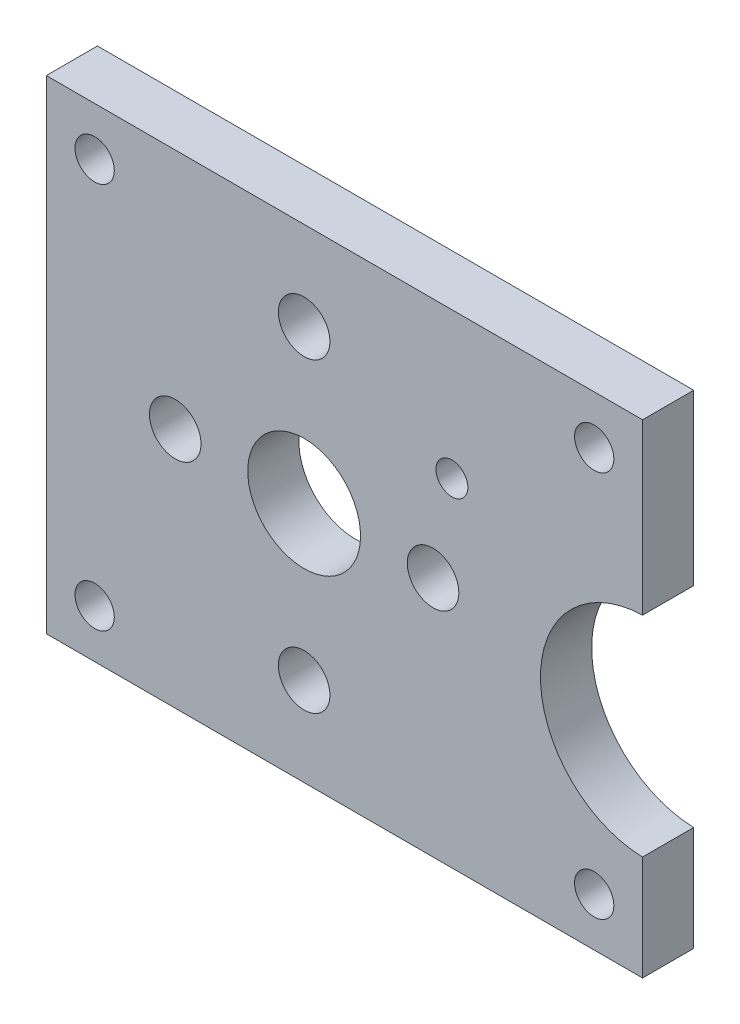
ISO-10303-21;
HEADER;
FILE_DESCRIPTION(('STEP AP214'),'2;1');
FILE_NAME('part.step','',(''),(''),'','','');
FILE_SCHEMA(('AUTOMOTIVE_DESIGN { 1 0 10303 214 1 1 1 1 }'));
ENDSEC;
DATA;
#1=APPLICATION_CONTEXT('core data for automotive mechanical design processes');
#2=APPLICATION_PROTOCOL_DEFINITION('international standard','automotive_design',2000,#1);
#3=PRODUCT_CONTEXT('',#1,'mechanical');
#4=PRODUCT('Part','Part','',(#3));
#5=PRODUCT_RELATED_PRODUCT_CATEGORY('part','',(#4));
#6=PRODUCT_DEFINITION_FORMATION('','',#4);
#7=PRODUCT_DEFINITION_CONTEXT('part definition',#1,'design');
#8=PRODUCT_DEFINITION('design','',#6,#7);
#9=PRODUCT_DEFINITION_SHAPE('','',#8);
#10=(LENGTH_UNIT() NAMED_UNIT(*) SI_UNIT(.MILLI.,.METRE.));
#11=(NAMED_UNIT(*) PLANE_ANGLE_UNIT() SI_UNIT($,.RADIAN.));
#12=(NAMED_UNIT(*) SI_UNIT($,.STERADIAN.) SOLID_ANGLE_UNIT());
#13=UNCERTAINTY_MEASURE_WITH_UNIT(LENGTH_MEASURE(1.E-05),#10,'distance_accuracy_value','');
#14=(GEOMETRIC_REPRESENTATION_CONTEXT(3) GLOBAL_UNCERTAINTY_ASSIGNED_CONTEXT((#13)) GLOBAL_UNIT_ASSIGNED_CONTEXT((#10,
#11,#12)) REPRESENTATION_CONTEXT('',''));
#15=CARTESIAN_POINT('',(0.,0.,0.));
#16=DIRECTION('',(0.,0.,1.));
#17=DIRECTION('',(1.,0.,0.));
#18=AXIS2_PLACEMENT_3D('',#15,#16,#17);
#19=CARTESIAN_POINT('',(37.1666992956996,13.,3.175));
#20=DIRECTION('',(0.,0.,1.));
#21=DIRECTION('',(1.,0.,0.));
#22=AXIS2_PLACEMENT_3D('',#19,#20,#21);
#23=PLANE('',#22);
#24=CARTESIAN_POINT('',(3.,27.,3.175));
#25=DIRECTION('',(0.,0.,1.));
#26=DIRECTION('',(1.,0.,0.));
#27=AXIS2_PLACEMENT_3D('',#24,#25,#26);
#28=CIRCLE('',#27,1.21919999999999);
#29=CARTESIAN_POINT('',(4.21919999999999,27.,3.175));
#30=VERTEX_POINT('',#29);
#31=EDGE_CURVE('E204',#30,#30,#28,.T.);
#32=ORIENTED_EDGE('',*,*,#31,.F.);
#33=EDGE_LOOP('',(#32));
#34=FACE_BOUND('',#33,.T.);
#35=CARTESIAN_POINT('',(3.,3.,3.175));
#36=DIRECTION('',(0.,0.,1.));
#37=DIRECTION('',(1.,0.,0.));
#38=AXIS2_PLACEMENT_3D('',#35,#36,#37);
#39=CIRCLE('',#38,1.21919999999999);
#40=CARTESIAN_POINT('',(4.21919999999999,3.,3.175));
#41=VERTEX_POINT('',#40);
#42=EDGE_CURVE('E208',#41,#41,#39,.T.);
#43=ORIENTED_EDGE('',*,*,#42,.F.);
#44=EDGE_LOOP('',(#43));
#45=FACE_BOUND('',#44,.T.);
#46=CARTESIAN_POINT('',(34.,3.,3.175));
#47=DIRECTION('',(0.,0.,1.));
#48=DIRECTION('',(1.,0.,0.));
#49=AXIS2_PLACEMENT_3D('',#46,#47,#48);
#50=CIRCLE('',#49,1.21919999999999);
#51=CARTESIAN_POINT('',(35.2192,3.,3.175));
#52=VERTEX_POINT('',#51);
#53=EDGE_CURVE('E217',#52,#52,#50,.T.);
#54=ORIENTED_EDGE('',*,*,#53,.F.);
#55=EDGE_LOOP('',(#54));
#56=FACE_BOUND('',#55,.T.);
#57=CARTESIAN_POINT('',(34.,27.,3.175));
#58=DIRECTION('',(0.,0.,1.));
#59=DIRECTION('',(1.,0.,0.));
#60=AXIS2_PLACEMENT_3D('',#57,#58,#59);
#61=CIRCLE('',#60,1.21919999999999);
#62=CARTESIAN_POINT('',(35.2192,27.,3.175));
#63=VERTEX_POINT('',#62);
#64=EDGE_CURVE('E223',#63,#63,#61,.T.);
#65=ORIENTED_EDGE('',*,*,#64,.F.);
#66=EDGE_LOOP('',(#65));
#67=FACE_BOUND('',#66,.T.);
#68=CARTESIAN_POINT('',(8.,15.,3.175));
#69=DIRECTION('',(0.,0.,1.));
#70=DIRECTION('',(-1.,0.,0.));
#71=AXIS2_PLACEMENT_3D('',#68,#69,#70);
#72=CIRCLE('',#71,1.6);
#73=CARTESIAN_POINT('',(6.4,15.,3.175));
#74=VERTEX_POINT('',#73);
#75=EDGE_CURVE('E236',#74,#74,#72,.T.);
#76=ORIENTED_EDGE('',*,*,#75,.F.);
#77=EDGE_LOOP('',(#76));
#78=FACE_BOUND('',#77,.T.);
#79=CARTESIAN_POINT('',(24.,15.,3.175));
#80=DIRECTION('',(0.,0.,1.));
#81=DIRECTION('',(1.,0.,0.));
#82=AXIS2_PLACEMENT_3D('',#79,#80,#81);
#83=CIRCLE('',#82,1.6);
#84=CARTESIAN_POINT('',(25.6,15.,3.175));
#85=VERTEX_POINT('',#84);
#86=EDGE_CURVE('E248',#85,#85,#83,.T.);
#87=ORIENTED_EDGE('',*,*,#86,.F.);
#88=EDGE_LOOP('',(#87));
#89=FACE_BOUND('',#88,.T.);
#90=CARTESIAN_POINT('',(25.1697789659621,20.9334001816327,3.175));
#91=DIRECTION('',(0.,0.,1.));
#92=DIRECTION('',(1.,0.,0.));
#93=AXIS2_PLACEMENT_3D('',#90,#91,#92);
#94=CIRCLE('',#93,0.990600000000001);
#95=CARTESIAN_POINT('',(26.1603789659621,20.9334001816327,3.175));
#96=VERTEX_POINT('',#95);
#97=EDGE_CURVE('E122',#96,#96,#94,.T.);
#98=ORIENTED_EDGE('',*,*,#97,.F.);
#99=EDGE_LOOP('',(#98));
#100=FACE_BOUND('',#99,.T.);
#101=DIRECTION('',(0.,-1.,0.));
#102=VECTOR('',#101,1.);
#103=CARTESIAN_POINT('',(0.,0.,3.175));
#104=LINE('',#103,#102);
#105=CARTESIAN_POINT('',(0.,30.,3.175));
#106=VERTEX_POINT('',#105);
#107=CARTESIAN_POINT('',(0.,0.,3.175));
#108=VERTEX_POINT('',#107);
#109=EDGE_CURVE('E129',#106,#108,#104,.T.);
#110=ORIENTED_EDGE('',*,*,#109,.T.);
#111=DIRECTION('',(1.,0.,0.));
#112=VECTOR('',#111,1.);
#113=CARTESIAN_POINT('',(0.,0.,3.175));
#114=LINE('',#113,#112);
#115=CARTESIAN_POINT('',(37.,0.,3.175));
#116=VERTEX_POINT('',#115);
#117=EDGE_CURVE('E87',#108,#116,#114,.T.);
#118=ORIENTED_EDGE('',*,*,#117,.T.);
#119=DIRECTION('',(0.,1.,0.));
#120=VECTOR('',#119,1.);
#121=CARTESIAN_POINT('',(37.,6.50213794045971,3.175));
#122=LINE('',#121,#120);
#123=CARTESIAN_POINT('',(37.,6.50213794045971,3.175));
#124=VERTEX_POINT('',#123);
#125=EDGE_CURVE('E100',#116,#124,#122,.T.);
#126=ORIENTED_EDGE('',*,*,#125,.T.);
#127=CARTESIAN_POINT('',(37.1666992956996,13.,3.175));
#128=DIRECTION('',(0.,0.,-1.));
#129=DIRECTION('',(1.,0.,0.));
#130=AXIS2_PLACEMENT_3D('',#127,#128,#129);
#131=CIRCLE('',#130,6.5);
#132=CARTESIAN_POINT('',(37.,19.4978620595403,3.175));
#133=VERTEX_POINT('',#132);
#134=EDGE_CURVE('E94',#124,#133,#131,.T.);
#135=ORIENTED_EDGE('',*,*,#134,.T.);
#136=DIRECTION('',(0.,1.,0.));
#137=VECTOR('',#136,1.);
#138=CARTESIAN_POINT('',(37.,19.4978620595403,3.175));
#139=LINE('',#138,#137);
#140=CARTESIAN_POINT('',(37.,30.,3.175));
#141=VERTEX_POINT('',#140);
#142=EDGE_CURVE('E98',#133,#141,#139,.T.);
#143=ORIENTED_EDGE('',*,*,#142,.T.);
#144=DIRECTION('',(-1.,0.,0.));
#145=VECTOR('',#144,1.);
#146=CARTESIAN_POINT('',(0.,30.,3.175));
#147=LINE('',#146,#145);
#148=EDGE_CURVE('E50',#141,#106,#147,.T.);
#149=ORIENTED_EDGE('',*,*,#148,.T.);
#150=EDGE_LOOP('',(#110,#118,#126,#135,#143,#149));
#151=FACE_BOUND('',#150,.T.);
#152=CARTESIAN_POINT('',(16.,24.5,3.175));
#153=DIRECTION('',(0.,0.,1.));
#154=DIRECTION('',(1.,0.,0.));
#155=AXIS2_PLACEMENT_3D('',#152,#153,#154);
#156=CIRCLE('',#155,1.6);
#157=CARTESIAN_POINT('',(17.6,24.5,3.175));
#158=VERTEX_POINT('',#157);
#159=EDGE_CURVE('E254',#158,#158,#156,.T.);
#160=ORIENTED_EDGE('',*,*,#159,.F.);
#161=EDGE_LOOP('',(#160));
#162=FACE_BOUND('',#161,.T.);
#163=CARTESIAN_POINT('',(16.,5.50000000000001,3.175));
#164=DIRECTION('',(0.,0.,1.));
#165=DIRECTION('',(-1.,0.,0.));
#166=AXIS2_PLACEMENT_3D('',#163,#164,#165);
#167=CIRCLE('',#166,1.6);
#168=CARTESIAN_POINT('',(14.4,5.50000000000001,3.175));
#169=VERTEX_POINT('',#168);
#170=EDGE_CURVE('E242',#169,#169,#167,.T.);
#171=ORIENTED_EDGE('',*,*,#170,.F.);
#172=EDGE_LOOP('',(#171));
#173=FACE_BOUND('',#172,.T.);
#174=CARTESIAN_POINT('',(16.,15.,3.175));
#175=DIRECTION('',(0.,0.,1.));
#176=DIRECTION('',(1.,0.,0.));
#177=AXIS2_PLACEMENT_3D('',#174,#175,#176);
#178=CIRCLE('',#177,3.5);
#179=CARTESIAN_POINT('',(19.5,15.,3.175));
#180=VERTEX_POINT('',#179);
#181=EDGE_CURVE('E230',#180,#180,#178,.T.);
#182=ORIENTED_EDGE('',*,*,#181,.F.);
#183=EDGE_LOOP('',(#182));
#184=FACE_BOUND('',#183,.T.);
#185=ADVANCED_FACE('F33',(#34,#45,#56,#67,#78,#89,#100,#151,#162,#173,#184),#23,.T.);
#186=CARTESIAN_POINT('',(37.1666992956996,13.,0.));
#187=DIRECTION('',(0.,0.,1.));
#188=DIRECTION('',(1.,0.,0.));
#189=AXIS2_PLACEMENT_3D('',#186,#187,#188);
#190=PLANE('',#189);
#191=CARTESIAN_POINT('',(3.,27.,0.));
#192=DIRECTION('',(0.,0.,1.));
#193=DIRECTION('',(1.,0.,0.));
#194=AXIS2_PLACEMENT_3D('',#191,#192,#193);
#195=CIRCLE('',#194,1.21919999999999);
#196=CARTESIAN_POINT('',(4.21919999999999,27.,0.));
#197=VERTEX_POINT('',#196);
#198=EDGE_CURVE('E207',#197,#197,#195,.T.);
#199=ORIENTED_EDGE('',*,*,#198,.T.);
#200=EDGE_LOOP('',(#199));
#201=FACE_BOUND('',#200,.T.);
#202=CARTESIAN_POINT('',(3.,3.,0.));
#203=DIRECTION('',(0.,0.,1.));
#204=DIRECTION('',(1.,0.,0.));
#205=AXIS2_PLACEMENT_3D('',#202,#203,#204);
#206=CIRCLE('',#205,1.21919999999999);
#207=CARTESIAN_POINT('',(4.21919999999999,3.,0.));
#208=VERTEX_POINT('',#207);
#209=EDGE_CURVE('E211',#208,#208,#206,.T.);
#210=ORIENTED_EDGE('',*,*,#209,.T.);
#211=EDGE_LOOP('',(#210));
#212=FACE_BOUND('',#211,.T.);
#213=CARTESIAN_POINT('',(34.,3.,0.));
#214=DIRECTION('',(0.,0.,1.));
#215=DIRECTION('',(1.,0.,0.));
#216=AXIS2_PLACEMENT_3D('',#213,#214,#215);
#217=CIRCLE('',#216,1.21919999999999);
#218=CARTESIAN_POINT('',(35.2192,3.,0.));
#219=VERTEX_POINT('',#218);
#220=EDGE_CURVE('E220',#219,#219,#217,.T.);
#221=ORIENTED_EDGE('',*,*,#220,.T.);
#222=EDGE_LOOP('',(#221));
#223=FACE_BOUND('',#222,.T.);
#224=CARTESIAN_POINT('',(34.,27.,0.));
#225=DIRECTION('',(0.,0.,1.));
#226=DIRECTION('',(1.,0.,0.));
#227=AXIS2_PLACEMENT_3D('',#224,#225,#226);
#228=CIRCLE('',#227,1.21919999999999);
#229=CARTESIAN_POINT('',(35.2192,27.,0.));
#230=VERTEX_POINT('',#229);
#231=EDGE_CURVE('E226',#230,#230,#228,.T.);
#232=ORIENTED_EDGE('',*,*,#231,.T.);
#233=EDGE_LOOP('',(#232));
#234=FACE_BOUND('',#233,.T.);
#235=CARTESIAN_POINT('',(8.,15.,0.));
#236=DIRECTION('',(0.,0.,1.));
#237=DIRECTION('',(-1.,0.,0.));
#238=AXIS2_PLACEMENT_3D('',#235,#236,#237);
#239=CIRCLE('',#238,1.6);
#240=CARTESIAN_POINT('',(6.4,15.,0.));
#241=VERTEX_POINT('',#240);
#242=EDGE_CURVE('E233',#241,#241,#239,.T.);
#243=ORIENTED_EDGE('',*,*,#242,.T.);
#244=EDGE_LOOP('',(#243));
#245=FACE_BOUND('',#244,.T.);
#246=CARTESIAN_POINT('',(24.,15.,0.));
#247=DIRECTION('',(0.,0.,1.));
#248=DIRECTION('',(1.,0.,0.));
#249=AXIS2_PLACEMENT_3D('',#246,#247,#248);
#250=CIRCLE('',#249,1.6);
#251=CARTESIAN_POINT('',(25.6,15.,0.));
#252=VERTEX_POINT('',#251);
#253=EDGE_CURVE('E245',#252,#252,#250,.T.);
#254=ORIENTED_EDGE('',*,*,#253,.T.);
#255=EDGE_LOOP('',(#254));
#256=FACE_BOUND('',#255,.T.);
#257=CARTESIAN_POINT('',(25.1697789659621,20.9334001816327,0.));
#258=DIRECTION('',(0.,0.,1.));
#259=DIRECTION('',(1.,0.,0.));
#260=AXIS2_PLACEMENT_3D('',#257,#258,#259);
#261=CIRCLE('',#260,0.990600000000001);
#262=CARTESIAN_POINT('',(26.1603789659621,20.9334001816327,0.));
#263=VERTEX_POINT('',#262);
#264=EDGE_CURVE('E257',#263,#263,#261,.T.);
#265=ORIENTED_EDGE('',*,*,#264,.T.);
#266=EDGE_LOOP('',(#265));
#267=FACE_BOUND('',#266,.T.);
#268=DIRECTION('',(0.,-1.,0.));
#269=VECTOR('',#268,1.);
#270=CARTESIAN_POINT('',(0.,0.,0.));
#271=LINE('',#270,#269);
#272=CARTESIAN_POINT('',(0.,30.,0.));
#273=VERTEX_POINT('',#272);
#274=CARTESIAN_POINT('',(0.,0.,0.));
#275=VERTEX_POINT('',#274);
#276=EDGE_CURVE('E118',#273,#275,#271,.T.);
#277=ORIENTED_EDGE('',*,*,#276,.F.);
#278=DIRECTION('',(-1.,0.,0.));
#279=VECTOR('',#278,1.);
#280=CARTESIAN_POINT('',(0.,30.,0.));
#281=LINE('',#280,#279);
#282=CARTESIAN_POINT('',(37.,30.,0.));
#283=VERTEX_POINT('',#282);
#284=EDGE_CURVE('E79',#283,#273,#281,.T.);
#285=ORIENTED_EDGE('',*,*,#284,.F.);
#286=DIRECTION('',(0.,1.,0.));
#287=VECTOR('',#286,1.);
#288=CARTESIAN_POINT('',(37.,19.4978620595403,0.));
#289=LINE('',#288,#287);
#290=CARTESIAN_POINT('',(37.,19.4978620595403,0.));
#291=VERTEX_POINT('',#290);
#292=EDGE_CURVE('E73',#291,#283,#289,.T.);
#293=ORIENTED_EDGE('',*,*,#292,.F.);
#294=CARTESIAN_POINT('',(37.1666992956996,13.,0.));
#295=DIRECTION('',(0.,0.,-1.));
#296=DIRECTION('',(1.,0.,0.));
#297=AXIS2_PLACEMENT_3D('',#294,#295,#296);
#298=CIRCLE('',#297,6.5);
#299=CARTESIAN_POINT('',(37.,6.50213794045971,0.));
#300=VERTEX_POINT('',#299);
#301=EDGE_CURVE('E108',#300,#291,#298,.T.);
#302=ORIENTED_EDGE('',*,*,#301,.F.);
#303=DIRECTION('',(0.,1.,0.));
#304=VECTOR('',#303,1.);
#305=CARTESIAN_POINT('',(37.,6.50213794045971,0.));
#306=LINE('',#305,#304);
#307=CARTESIAN_POINT('',(37.,0.,0.));
#308=VERTEX_POINT('',#307);
#309=EDGE_CURVE('E124',#308,#300,#306,.T.);
#310=ORIENTED_EDGE('',*,*,#309,.F.);
#311=DIRECTION('',(1.,0.,0.));
#312=VECTOR('',#311,1.);
#313=CARTESIAN_POINT('',(0.,0.,0.));
#314=LINE('',#313,#312);
#315=EDGE_CURVE('E121',#275,#308,#314,.T.);
#316=ORIENTED_EDGE('',*,*,#315,.F.);
#317=EDGE_LOOP('',(#277,#285,#293,#302,#310,#316));
#318=FACE_BOUND('',#317,.T.);
#319=CARTESIAN_POINT('',(16.,24.5,0.));
#320=DIRECTION('',(0.,0.,1.));
#321=DIRECTION('',(1.,0.,0.));
#322=AXIS2_PLACEMENT_3D('',#319,#320,#321);
#323=CIRCLE('',#322,1.6);
#324=CARTESIAN_POINT('',(17.6,24.5,0.));
#325=VERTEX_POINT('',#324);
#326=EDGE_CURVE('E251',#325,#325,#323,.T.);
#327=ORIENTED_EDGE('',*,*,#326,.T.);
#328=EDGE_LOOP('',(#327));
#329=FACE_BOUND('',#328,.T.);
#330=CARTESIAN_POINT('',(16.,5.50000000000001,0.));
#331=DIRECTION('',(0.,0.,1.));
#332=DIRECTION('',(-1.,0.,0.));
#333=AXIS2_PLACEMENT_3D('',#330,#331,#332);
#334=CIRCLE('',#333,1.6);
#335=CARTESIAN_POINT('',(14.4,5.50000000000001,0.));
#336=VERTEX_POINT('',#335);
#337=EDGE_CURVE('E239',#336,#336,#334,.T.);
#338=ORIENTED_EDGE('',*,*,#337,.T.);
#339=EDGE_LOOP('',(#338));
#340=FACE_BOUND('',#339,.T.);
#341=CARTESIAN_POINT('',(16.,15.,0.));
#342=DIRECTION('',(0.,0.,1.));
#343=DIRECTION('',(1.,0.,0.));
#344=AXIS2_PLACEMENT_3D('',#341,#342,#343);
#345=CIRCLE('',#344,3.5);
#346=CARTESIAN_POINT('',(19.5,15.,0.));
#347=VERTEX_POINT('',#346);
#348=EDGE_CURVE('E229',#347,#347,#345,.T.);
#349=ORIENTED_EDGE('',*,*,#348,.T.);
#350=EDGE_LOOP('',(#349));
#351=FACE_BOUND('',#350,.T.);
#352=ADVANCED_FACE('F138',(#201,#212,#223,#234,#245,#256,#267,#318,#329,#340,#351),#190,.F.);
#353=CARTESIAN_POINT('',(0.,0.,3.175));
#354=DIRECTION('',(1.,0.,0.));
#355=DIRECTION('',(0.,0.,-1.));
#356=AXIS2_PLACEMENT_3D('',#353,#354,#355);
#357=PLANE('',#356);
#358=ORIENTED_EDGE('',*,*,#276,.T.);
#359=DIRECTION('',(0.,0.,-1.));
#360=VECTOR('',#359,1.);
#361=CARTESIAN_POINT('',(0.,0.,3.175));
#362=LINE('',#361,#360);
#363=EDGE_CURVE('E11',#108,#275,#362,.T.);
#364=ORIENTED_EDGE('',*,*,#363,.F.);
#365=ORIENTED_EDGE('',*,*,#109,.F.);
#366=DIRECTION('',(0.,0.,-1.));
#367=VECTOR('',#366,1.);
#368=CARTESIAN_POINT('',(0.,30.,3.175));
#369=LINE('',#368,#367);
#370=EDGE_CURVE('E114',#106,#273,#369,.T.);
#371=ORIENTED_EDGE('',*,*,#370,.T.);
#372=EDGE_LOOP('',(#358,#364,#365,#371));
#373=FACE_BOUND('',#372,.T.);
#374=ADVANCED_FACE('F35',(#373),#357,.F.);
#375=CARTESIAN_POINT('',(0.,0.,3.175));
#376=DIRECTION('',(0.,1.,0.));
#377=DIRECTION('',(0.,0.,1.));
#378=AXIS2_PLACEMENT_3D('',#375,#376,#377);
#379=PLANE('',#378);
#380=ORIENTED_EDGE('',*,*,#315,.T.);
#381=DIRECTION('',(0.,0.,-1.));
#382=VECTOR('',#381,1.);
#383=CARTESIAN_POINT('',(37.,0.,3.175));
#384=LINE('',#383,#382);
#385=EDGE_CURVE('E42',#116,#308,#384,.T.);
#386=ORIENTED_EDGE('',*,*,#385,.F.);
#387=ORIENTED_EDGE('',*,*,#117,.F.);
#388=ORIENTED_EDGE('',*,*,#363,.T.);
#389=EDGE_LOOP('',(#380,#386,#387,#388));
#390=FACE_BOUND('',#389,.T.);
#391=ADVANCED_FACE('F371',(#390),#379,.F.);
#392=CARTESIAN_POINT('',(37.,6.50213794045971,3.175));
#393=DIRECTION('',(-1.,0.,0.));
#394=DIRECTION('',(0.,0.,1.));
#395=AXIS2_PLACEMENT_3D('',#392,#393,#394);
#396=PLANE('',#395);
#397=ORIENTED_EDGE('',*,*,#309,.T.);
#398=DIRECTION('',(0.,0.,-1.));
#399=VECTOR('',#398,1.);
#400=CARTESIAN_POINT('',(37.,6.50213794045971,3.175));
#401=LINE('',#400,#399);
#402=EDGE_CURVE('E109',#124,#300,#401,.T.);
#403=ORIENTED_EDGE('',*,*,#402,.F.);
#404=ORIENTED_EDGE('',*,*,#125,.F.);
#405=ORIENTED_EDGE('',*,*,#385,.T.);
#406=EDGE_LOOP('',(#397,#403,#404,#405));
#407=FACE_BOUND('',#406,.T.);
#408=ADVANCED_FACE('F135',(#407),#396,.F.);
#409=CARTESIAN_POINT('',(37.1666992956996,13.,3.175));
#410=DIRECTION('',(0.,0.,-1.));
#411=DIRECTION('',(-1.,0.,0.));
#412=AXIS2_PLACEMENT_3D('',#409,#410,#411);
#413=CYLINDRICAL_SURFACE('',#412,6.5);
#414=ORIENTED_EDGE('',*,*,#301,.T.);
#415=DIRECTION('',(0.,0.,-1.));
#416=VECTOR('',#415,1.);
#417=CARTESIAN_POINT('',(37.,19.4978620595403,3.175));
#418=LINE('',#417,#416);
#419=EDGE_CURVE('E105',#133,#291,#418,.T.);
#420=ORIENTED_EDGE('',*,*,#419,.F.);
#421=ORIENTED_EDGE('',*,*,#134,.F.);
#422=ORIENTED_EDGE('',*,*,#402,.T.);
#423=EDGE_LOOP('',(#414,#420,#421,#422));
#424=FACE_BOUND('',#423,.T.);
#425=ADVANCED_FACE('F106',(#424),#413,.F.);
#426=CARTESIAN_POINT('',(37.,19.4978620595403,3.175));
#427=DIRECTION('',(-1.,0.,0.));
#428=DIRECTION('',(0.,0.,1.));
#429=AXIS2_PLACEMENT_3D('',#426,#427,#428);
#430=PLANE('',#429);
#431=ORIENTED_EDGE('',*,*,#292,.T.);
#432=DIRECTION('',(0.,0.,-1.));
#433=VECTOR('',#432,1.);
#434=CARTESIAN_POINT('',(37.,30.,3.175));
#435=LINE('',#434,#433);
#436=EDGE_CURVE('E110',#141,#283,#435,.T.);
#437=ORIENTED_EDGE('',*,*,#436,.F.);
#438=ORIENTED_EDGE('',*,*,#142,.F.);
#439=ORIENTED_EDGE('',*,*,#419,.T.);
#440=EDGE_LOOP('',(#431,#437,#438,#439));
#441=FACE_BOUND('',#440,.T.);
#442=ADVANCED_FACE('F112',(#441),#430,.F.);
#443=CARTESIAN_POINT('',(0.,30.,3.175));
#444=DIRECTION('',(0.,-1.,0.));
#445=DIRECTION('',(1.,0.,0.));
#446=AXIS2_PLACEMENT_3D('',#443,#444,#445);
#447=PLANE('',#446);
#448=ORIENTED_EDGE('',*,*,#284,.T.);
#449=ORIENTED_EDGE('',*,*,#370,.F.);
#450=ORIENTED_EDGE('',*,*,#148,.F.);
#451=ORIENTED_EDGE('',*,*,#436,.T.);
#452=EDGE_LOOP('',(#448,#449,#450,#451));
#453=FACE_BOUND('',#452,.T.);
#454=ADVANCED_FACE('F143',(#453),#447,.F.);
#455=CARTESIAN_POINT('',(25.1697789659621,20.9334001816327,3.175));
#456=DIRECTION('',(0.,0.,-1.));
#457=DIRECTION('',(-1.,0.,0.));
#458=AXIS2_PLACEMENT_3D('',#455,#456,#457);
#459=CYLINDRICAL_SURFACE('',#458,0.990600000000001);
#460=ORIENTED_EDGE('',*,*,#97,.T.);
#461=EDGE_LOOP('',(#460));
#462=FACE_BOUND('',#461,.T.);
#463=ORIENTED_EDGE('',*,*,#264,.F.);
#464=EDGE_LOOP('',(#463));
#465=FACE_BOUND('',#464,.T.);
#466=ADVANCED_FACE('F145',(#462,#465),#459,.F.);
#467=CARTESIAN_POINT('',(16.,24.5,3.175));
#468=DIRECTION('',(0.,0.,-1.));
#469=DIRECTION('',(-1.,0.,0.));
#470=AXIS2_PLACEMENT_3D('',#467,#468,#469);
#471=CYLINDRICAL_SURFACE('',#470,1.6);
#472=ORIENTED_EDGE('',*,*,#159,.T.);
#473=EDGE_LOOP('',(#472));
#474=FACE_BOUND('',#473,.T.);
#475=ORIENTED_EDGE('',*,*,#326,.F.);
#476=EDGE_LOOP('',(#475));
#477=FACE_BOUND('',#476,.T.);
#478=ADVANCED_FACE('F151',(#474,#477),#471,.F.);
#479=CARTESIAN_POINT('',(24.,15.,3.175));
#480=DIRECTION('',(0.,0.,-1.));
#481=DIRECTION('',(-1.,0.,0.));
#482=AXIS2_PLACEMENT_3D('',#479,#480,#481);
#483=CYLINDRICAL_SURFACE('',#482,1.6);
#484=ORIENTED_EDGE('',*,*,#86,.T.);
#485=EDGE_LOOP('',(#484));
#486=FACE_BOUND('',#485,.T.);
#487=ORIENTED_EDGE('',*,*,#253,.F.);
#488=EDGE_LOOP('',(#487));
#489=FACE_BOUND('',#488,.T.);
#490=ADVANCED_FACE('F168',(#486,#489),#483,.F.);
#491=CARTESIAN_POINT('',(16.,5.50000000000001,3.175));
#492=DIRECTION('',(0.,0.,-1.));
#493=DIRECTION('',(-1.,0.,0.));
#494=AXIS2_PLACEMENT_3D('',#491,#492,#493);
#495=CYLINDRICAL_SURFACE('',#494,1.6);
#496=ORIENTED_EDGE('',*,*,#170,.T.);
#497=EDGE_LOOP('',(#496));
#498=FACE_BOUND('',#497,.T.);
#499=ORIENTED_EDGE('',*,*,#337,.F.);
#500=EDGE_LOOP('',(#499));
#501=FACE_BOUND('',#500,.T.);
#502=ADVANCED_FACE('F172',(#498,#501),#495,.F.);
#503=CARTESIAN_POINT('',(8.,15.,3.175));
#504=DIRECTION('',(0.,0.,-1.));
#505=DIRECTION('',(-1.,0.,0.));
#506=AXIS2_PLACEMENT_3D('',#503,#504,#505);
#507=CYLINDRICAL_SURFACE('',#506,1.6);
#508=ORIENTED_EDGE('',*,*,#75,.T.);
#509=EDGE_LOOP('',(#508));
#510=FACE_BOUND('',#509,.T.);
#511=ORIENTED_EDGE('',*,*,#242,.F.);
#512=EDGE_LOOP('',(#511));
#513=FACE_BOUND('',#512,.T.);
#514=ADVANCED_FACE('F176',(#510,#513),#507,.F.);
#515=CARTESIAN_POINT('',(16.,15.,3.175));
#516=DIRECTION('',(0.,0.,-1.));
#517=DIRECTION('',(-1.,0.,0.));
#518=AXIS2_PLACEMENT_3D('',#515,#516,#517);
#519=CYLINDRICAL_SURFACE('',#518,3.5);
#520=ORIENTED_EDGE('',*,*,#181,.T.);
#521=EDGE_LOOP('',(#520));
#522=FACE_BOUND('',#521,.T.);
#523=ORIENTED_EDGE('',*,*,#348,.F.);
#524=EDGE_LOOP('',(#523));
#525=FACE_BOUND('',#524,.T.);
#526=ADVANCED_FACE('F180',(#522,#525),#519,.F.);
#527=CARTESIAN_POINT('',(34.,27.,3.175));
#528=DIRECTION('',(0.,0.,1.));
#529=DIRECTION('',(1.,0.,0.));
#530=AXIS2_PLACEMENT_3D('',#527,#528,#529);
#531=CYLINDRICAL_SURFACE('',#530,1.21919999999999);
#532=ORIENTED_EDGE('',*,*,#64,.T.);
#533=EDGE_LOOP('',(#532));
#534=FACE_BOUND('',#533,.T.);
#535=ORIENTED_EDGE('',*,*,#231,.F.);
#536=EDGE_LOOP('',(#535));
#537=FACE_BOUND('',#536,.T.);
#538=ADVANCED_FACE('F184',(#534,#537),#531,.F.);
#539=CARTESIAN_POINT('',(34.,3.,3.175));
#540=DIRECTION('',(0.,0.,1.));
#541=DIRECTION('',(1.,0.,0.));
#542=AXIS2_PLACEMENT_3D('',#539,#540,#541);
#543=CYLINDRICAL_SURFACE('',#542,1.21919999999999);
#544=ORIENTED_EDGE('',*,*,#53,.T.);
#545=EDGE_LOOP('',(#544));
#546=FACE_BOUND('',#545,.T.);
#547=ORIENTED_EDGE('',*,*,#220,.F.);
#548=EDGE_LOOP('',(#547));
#549=FACE_BOUND('',#548,.T.);
#550=ADVANCED_FACE('F188',(#546,#549),#543,.F.);
#551=CARTESIAN_POINT('',(3.,3.,3.175));
#552=DIRECTION('',(0.,0.,1.));
#553=DIRECTION('',(1.,0.,0.));
#554=AXIS2_PLACEMENT_3D('',#551,#552,#553);
#555=CYLINDRICAL_SURFACE('',#554,1.21919999999999);
#556=ORIENTED_EDGE('',*,*,#42,.T.);
#557=EDGE_LOOP('',(#556));
#558=FACE_BOUND('',#557,.T.);
#559=ORIENTED_EDGE('',*,*,#209,.F.);
#560=EDGE_LOOP('',(#559));
#561=FACE_BOUND('',#560,.T.);
#562=ADVANCED_FACE('F192',(#558,#561),#555,.F.);
#563=CARTESIAN_POINT('',(3.,27.,3.175));
#564=DIRECTION('',(0.,0.,1.));
#565=DIRECTION('',(1.,0.,0.));
#566=AXIS2_PLACEMENT_3D('',#563,#564,#565);
#567=CYLINDRICAL_SURFACE('',#566,1.21919999999999);
#568=ORIENTED_EDGE('',*,*,#31,.T.);
#569=EDGE_LOOP('',(#568));
#570=FACE_BOUND('',#569,.T.);
#571=ORIENTED_EDGE('',*,*,#198,.F.);
#572=EDGE_LOOP('',(#571));
#573=FACE_BOUND('',#572,.T.);
#574=ADVANCED_FACE('F196',(#570,#573),#567,.F.);
#575=CLOSED_SHELL('',(#185,#352,#374,#391,#408,#425,#442,#454,#466,#478,#490,#502,#514,#526,
#538,#550,#562,#574));
#576=MANIFOLD_SOLID_BREP('B2',#575);
#577=ADVANCED_BREP_SHAPE_REPRESENTATION('',(#18,#576),#14);
#578=SHAPE_DEFINITION_REPRESENTATION(#9,#577);
ENDSEC;
END-ISO-10303-21;
